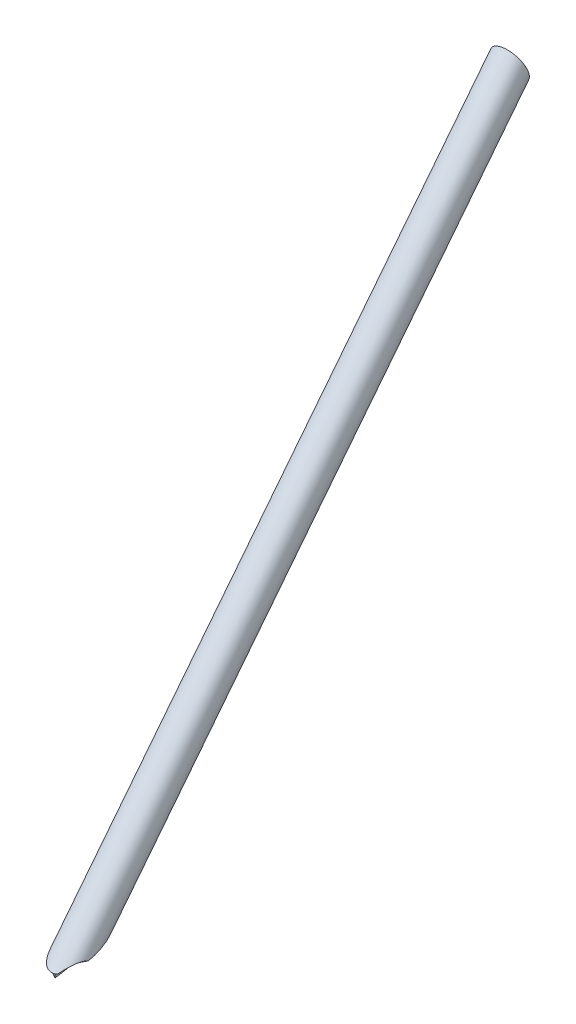
ISO-10303-21;
HEADER;
FILE_DESCRIPTION(('STEP AP214'),'2;1');
FILE_NAME('part.step','',(''),(''),'','','');
FILE_SCHEMA(('AUTOMOTIVE_DESIGN { 1 0 10303 214 1 1 1 1 }'));
ENDSEC;
DATA;
#1=APPLICATION_CONTEXT('core data for automotive mechanical design processes');
#2=APPLICATION_PROTOCOL_DEFINITION('international standard','automotive_design',2000,#1);
#3=PRODUCT_CONTEXT('',#1,'mechanical');
#4=PRODUCT('Part','Part','',(#3));
#5=PRODUCT_RELATED_PRODUCT_CATEGORY('part','',(#4));
#6=PRODUCT_DEFINITION_FORMATION('','',#4);
#7=PRODUCT_DEFINITION_CONTEXT('part definition',#1,'design');
#8=PRODUCT_DEFINITION('design','',#6,#7);
#9=PRODUCT_DEFINITION_SHAPE('','',#8);
#10=(LENGTH_UNIT() NAMED_UNIT(*) SI_UNIT(.MILLI.,.METRE.));
#11=(NAMED_UNIT(*) PLANE_ANGLE_UNIT() SI_UNIT($,.RADIAN.));
#12=(NAMED_UNIT(*) SI_UNIT($,.STERADIAN.) SOLID_ANGLE_UNIT());
#13=UNCERTAINTY_MEASURE_WITH_UNIT(LENGTH_MEASURE(1.E-05),#10,'distance_accuracy_value','');
#14=(GEOMETRIC_REPRESENTATION_CONTEXT(3) GLOBAL_UNCERTAINTY_ASSIGNED_CONTEXT((#13)) GLOBAL_UNIT_ASSIGNED_CONTEXT((#10,
#11,#12)) REPRESENTATION_CONTEXT('',''));
#15=CARTESIAN_POINT('',(0.,0.,0.));
#16=DIRECTION('',(0.,0.,1.));
#17=DIRECTION('',(1.,0.,0.));
#18=AXIS2_PLACEMENT_3D('',#15,#16,#17);
#19=CARTESIAN_POINT('',(80.,380.,-601.037933611912));
#20=DIRECTION('',(0.313257210262409,-0.388871019636094,0.866400167535647));
#21=DIRECTION('',(0.,-0.912318699307092,-0.409480879766828));
#22=AXIS2_PLACEMENT_3D('',#19,#20,#21);
#23=CYLINDRICAL_SURFACE('',#22,7.9);
#24=CARTESIAN_POINT('',(222.917953673779,195.377291508024,-208.993378649136));
#25=CARTESIAN_POINT('',(223.012888083571,195.433726930084,-209.119116882952));
#26=CARTESIAN_POINT('',(223.104138431984,195.494269848754,-209.245777184897));
#27=CARTESIAN_POINT('',(223.280105681698,195.622380933649,-209.500115327002));
#28=CARTESIAN_POINT('',(223.364820289401,195.689951546758,-209.627793507182));
#29=CARTESIAN_POINT('',(223.528634818153,195.831254385907,-209.883653952705));
#30=CARTESIAN_POINT('',(223.607725975371,195.904995855745,-210.011836689933));
#31=CARTESIAN_POINT('',(223.76092313275,196.05782740779,-210.26800651156));
#32=CARTESIAN_POINT('',(223.835028227753,196.136918455949,-210.395993556333));
#33=CARTESIAN_POINT('',(224.052309585371,196.382926969586,-210.781500524532));
#34=CARTESIAN_POINT('',(224.188892439851,196.557188455598,-211.038071091827));
#35=CARTESIAN_POINT('',(224.448919782311,196.921959419964,-211.545800007279));
#36=CARTESIAN_POINT('',(224.57237338362,197.112457460483,-211.796962011791));
#37=CARTESIAN_POINT('',(224.776942315472,197.454170356937,-212.224321036627));
#38=CARTESIAN_POINT('',(224.860398831385,197.601869886103,-212.402224269208));
#39=CARTESIAN_POINT('',(225.022962726354,197.904873781393,-212.753515374758));
#40=CARTESIAN_POINT('',(225.102069764739,198.06017874141,-212.926902893479));
#41=CARTESIAN_POINT('',(225.256678731087,198.37843097543,-213.268551379093));
#42=CARTESIAN_POINT('',(225.33217691551,198.541385851937,-213.436806959756));
#43=CARTESIAN_POINT('',(225.479981924259,198.874812249495,-213.767151978885));
#44=CARTESIAN_POINT('',(225.552288904873,199.04528340162,-213.929241719269));
#45=CARTESIAN_POINT('',(225.693490547132,199.392433386815,-214.24496796628));
#46=CARTESIAN_POINT('',(225.762408546937,199.56904896406,-214.398663460934));
#47=CARTESIAN_POINT('',(225.897711302474,199.93003633822,-214.697916975524));
#48=CARTESIAN_POINT('',(225.964095766927,200.114409021873,-214.84347406068));
#49=CARTESIAN_POINT('',(226.094345245231,200.490856212502,-215.124827940735));
#50=CARTESIAN_POINT('',(226.158213993559,200.682918378672,-215.260639469395));
#51=CARTESIAN_POINT('',(226.283530904535,201.075232073558,-215.521007538282));
#52=CARTESIAN_POINT('',(226.344979958603,201.27548052995,-215.645568245636));
#53=CARTESIAN_POINT('',(226.447392881952,201.623434466193,-215.846156403963));
#54=CARTESIAN_POINT('',(226.489000040282,201.768996786018,-215.925578307174));
#55=CARTESIAN_POINT('',(226.570879988235,202.064336964657,-216.076936352935));
#56=CARTESIAN_POINT('',(226.611152863824,202.21411455073,-216.148872978398));
#57=CARTESIAN_POINT('',(226.690286353838,202.518084660041,-216.284297909734));
#58=CARTESIAN_POINT('',(226.729144961922,202.672282939986,-216.347774529356));
#59=CARTESIAN_POINT('',(226.805203274731,202.984791359438,-216.464918322809));
#60=CARTESIAN_POINT('',(226.842402945545,203.143101582897,-216.518585296182));
#61=CARTESIAN_POINT('',(226.915318707242,203.465472644867,-216.615237316068));
#62=CARTESIAN_POINT('',(226.951011861693,203.629579509086,-216.658087577271));
#63=CARTESIAN_POINT('',(227.020095881777,203.961225532968,-216.730573180454));
#64=CARTESIAN_POINT('',(227.053486514953,204.128765036973,-216.7602071898));
#65=CARTESIAN_POINT('',(227.117453561461,204.465988042297,-216.804360539596));
#66=CARTESIAN_POINT('',(227.148036352898,204.635665636074,-216.818914949004));
#67=CARTESIAN_POINT('',(227.205953992873,204.97617559598,-216.831164635051));
#68=CARTESIAN_POINT('',(227.233290498168,205.147007325631,-216.828868549318));
#69=CARTESIAN_POINT('',(227.27660869455,205.437357188732,-216.809230315878));
#70=CARTESIAN_POINT('',(227.293552559481,205.557058073156,-216.796555616039));
#71=CARTESIAN_POINT('',(227.325367727987,205.79532950089,-216.761653431045));
#72=CARTESIAN_POINT('',(227.340239534495,205.913900311961,-216.73942826936));
#73=CARTESIAN_POINT('',(227.36772712879,206.1489753004,-216.685192411289));
#74=CARTESIAN_POINT('',(227.38034435484,206.265480752278,-216.653187988955));
#75=CARTESIAN_POINT('',(227.403191134437,206.495590795566,-216.579366525467));
#76=CARTESIAN_POINT('',(227.413420617519,206.609195301279,-216.5375491948));
#77=CARTESIAN_POINT('',(227.431404675484,206.83273599438,-216.44427565963));
#78=CARTESIAN_POINT('',(227.439156342965,206.942667737856,-216.392808243457));
#79=CARTESIAN_POINT('',(227.45212980558,207.157958152705,-216.280717691105));
#80=CARTESIAN_POINT('',(227.457350720433,207.263315221268,-216.22009137876));
#81=CARTESIAN_POINT('',(227.465277056629,207.4688063395,-216.090339044893));
#82=CARTESIAN_POINT('',(227.467981496067,207.568938336028,-216.021209717486));
#83=CARTESIAN_POINT('',(227.47094093104,207.763484956176,-215.875268256289));
#84=CARTESIAN_POINT('',(227.47119539067,207.857898324429,-215.798454445325));
#85=CARTESIAN_POINT('',(227.469129930289,208.063698052783,-215.617846764081));
#86=CARTESIAN_POINT('',(227.466147125814,208.17338879079,-215.512123181927));
#87=CARTESIAN_POINT('',(227.456780942833,208.383190077019,-215.291735007128));
#88=CARTESIAN_POINT('',(227.450396486557,208.483297577053,-215.177067590582));
#89=CARTESIAN_POINT('',(227.426556723743,208.769705265191,-214.82174132444));
#90=CARTESIAN_POINT('',(227.404417576352,208.941919936901,-214.569913228727));
#91=CARTESIAN_POINT('',(227.356234764604,209.216028962779,-214.107933438384));
#92=CARTESIAN_POINT('',(227.332272238128,209.324979180344,-213.901580818846));
#93=CARTESIAN_POINT('',(227.279095846365,209.524792600736,-213.480815802341));
#94=CARTESIAN_POINT('',(227.249879002338,209.615645482055,-213.266398888436));
#95=CARTESIAN_POINT('',(227.186772988359,209.781289980862,-212.831758977117));
#96=CARTESIAN_POINT('',(227.152875525742,209.85605247573,-212.611526248664));
#97=CARTESIAN_POINT('',(227.080876774896,209.991170373415,-212.167307852279));
#98=CARTESIAN_POINT('',(227.042773938359,210.051520443912,-211.943320828028));
#99=CARTESIAN_POINT('',(226.967170071168,210.153281906896,-211.51831938256));
#100=CARTESIAN_POINT('',(226.930083203064,210.196059843876,-211.317554095141));
#101=CARTESIAN_POINT('',(226.85293914097,210.272416541946,-210.914835503661));
#102=CARTESIAN_POINT('',(226.812881475298,210.305993838234,-210.712882015653));
#103=CARTESIAN_POINT('',(226.68827982986,210.394200770023,-210.105851263459));
#104=CARTESIAN_POINT('',(226.599343421633,210.436258600358,-209.699807799988));
#105=CARTESIAN_POINT('',(226.40913766025,210.492057891408,-208.888068066644));
#106=CARTESIAN_POINT('',(226.307846584326,210.505748692749,-208.482373709036));
#107=CARTESIAN_POINT('',(226.091354588214,210.508417497333,-207.674828554905));
#108=CARTESIAN_POINT('',(225.976160610319,210.497407786651,-207.272975947341));
#109=CARTESIAN_POINT('',(225.763795783198,210.459623860329,-206.58938036356));
#110=CARTESIAN_POINT('',(225.67083158185,210.438230593355,-206.306016005625));
#111=CARTESIAN_POINT('',(225.474155076724,210.384826129073,-205.743942110612));
#112=CARTESIAN_POINT('',(225.370440492558,210.352812675813,-205.465233575753));
#113=CARTESIAN_POINT('',(225.149939011165,210.278697870624,-204.915178227719));
#114=CARTESIAN_POINT('',(225.033185126912,210.236621700209,-204.643814891119));
#115=CARTESIAN_POINT('',(224.782856186307,210.142507957935,-204.110762193817));
#116=CARTESIAN_POINT('',(224.64929217133,210.090476913159,-203.849066627678));
#117=CARTESIAN_POINT('',(224.424528459865,210.001528868784,-203.452660568413));
#118=CARTESIAN_POINT('',(224.340714883951,209.968103612592,-203.312972759542));
#119=CARTESIAN_POINT('',(224.165502575251,209.898009301119,-203.039301887405));
#120=CARTESIAN_POINT('',(224.07410623106,209.861341267085,-202.905317047656));
#121=CARTESIAN_POINT('',(223.882978374415,209.784689112119,-202.644700624613));
#122=CARTESIAN_POINT('',(223.783259196538,209.744709899061,-202.518058615116));
#123=CARTESIAN_POINT('',(223.574674929642,209.661237798938,-202.273755976076));
#124=CARTESIAN_POINT('',(223.46581187372,209.617745693031,-202.156093361056));
#125=CARTESIAN_POINT('',(223.257198986513,209.534480814693,-201.950119399441));
#126=CARTESIAN_POINT('',(223.158864877578,209.495260820413,-201.860152986442));
#127=CARTESIAN_POINT('',(222.955755076029,209.41413902135,-201.689159176252));
#128=CARTESIAN_POINT('',(222.850980978708,209.372237880628,-201.60812957905));
#129=CARTESIAN_POINT('',(222.635580996831,209.28567993122,-201.456108997409));
#130=CARTESIAN_POINT('',(222.524959774306,209.241025313343,-201.385110176307));
#131=CARTESIAN_POINT('',(222.298673344678,209.148832520759,-201.253819301503));
#132=CARTESIAN_POINT('',(222.183008023939,209.10129428108,-201.193527489166));
#133=CARTESIAN_POINT('',(221.947946209618,209.003301821729,-201.08404474988));
#134=CARTESIAN_POINT('',(221.828554782513,208.952851488607,-201.034839438096));
#135=CARTESIAN_POINT('',(221.587170362089,208.848873809021,-200.947303863317));
#136=CARTESIAN_POINT('',(221.465177335506,208.7953464232,-200.908973739456));
#137=CARTESIAN_POINT('',(221.219635699899,208.6850060593,-200.84263902345));
#138=CARTESIAN_POINT('',(221.096084831561,208.628187738916,-200.814651797489));
#139=CARTESIAN_POINT('',(220.848740169297,208.511212165082,-200.768343470395));
#140=CARTESIAN_POINT('',(220.72494631865,208.451054011646,-200.750024988817));
#141=CARTESIAN_POINT('',(220.427388225815,208.301836143796,-200.716481000202));
#142=CARTESIAN_POINT('',(220.253987472562,208.211055871608,-200.705617554726));
#143=CARTESIAN_POINT('',(219.910873942064,208.022246686899,-200.698951509076));
#144=CARTESIAN_POINT('',(219.74116264417,207.924214933685,-200.703154842086));
#145=CARTESIAN_POINT('',(219.406967398977,207.720526131168,-200.724369254203));
#146=CARTESIAN_POINT('',(219.242489569331,207.614860598322,-200.741394787105));
#147=CARTESIAN_POINT('',(218.920338997022,207.395819981203,-200.786311135998));
#148=CARTESIAN_POINT('',(218.762665566206,207.282445679547,-200.814200850383));
#149=CARTESIAN_POINT('',(218.451143834345,207.044747848438,-200.8800687085));
#150=CARTESIAN_POINT('',(218.297509602692,206.920212984307,-200.918296003976));
#151=CARTESIAN_POINT('',(217.999697113041,206.662911240161,-201.002982012353));
#152=CARTESIAN_POINT('',(217.855518972799,206.530144257672,-201.049440827734));
#153=CARTESIAN_POINT('',(217.577684913564,206.256559124255,-201.149316624965));
#154=CARTESIAN_POINT('',(217.444025502087,206.115743672658,-201.20273128153));
#155=CARTESIAN_POINT('',(217.188143780322,205.82629222245,-201.315446203212));
#156=CARTESIAN_POINT('',(217.065921683216,205.67765607815,-201.374746577991));
#157=CARTESIAN_POINT('',(216.818449707006,205.352758974325,-201.506466109889));
#158=CARTESIAN_POINT('',(216.694943875566,205.175447006607,-201.579582460562));
#159=CARTESIAN_POINT('',(216.465036896667,204.812085638978,-201.730891239238));
#160=CARTESIAN_POINT('',(216.358637262913,204.626035467714,-201.809084115598));
#161=CARTESIAN_POINT('',(216.164085426222,204.246214889201,-201.969410091894));
#162=CARTESIAN_POINT('',(216.075934819798,204.052443808257,-202.051543535795));
#163=CARTESIAN_POINT('',(215.918889566562,203.65845011928,-202.218683884007));
#164=CARTESIAN_POINT('',(215.849993628238,203.458227944962,-202.303690595164));
#165=CARTESIAN_POINT('',(215.734867726172,203.061803652908,-202.471769907068));
#166=CARTESIAN_POINT('',(215.687764802661,202.865819763355,-202.554759983785));
#167=CARTESIAN_POINT('',(215.612343670876,202.470666681872,-202.72168872225));
#168=CARTESIAN_POINT('',(215.584025008878,202.271497566998,-202.805627361036));
#169=CARTESIAN_POINT('',(215.546447957857,201.871514583643,-202.973728691702));
#170=CARTESIAN_POINT('',(215.537185499508,201.670701075508,-203.057891331904));
#171=CARTESIAN_POINT('',(215.537750207621,201.268949260368,-203.225844852274));
#172=CARTESIAN_POINT('',(215.547577042793,201.06801095559,-203.309635738869));
#173=CARTESIAN_POINT('',(215.585424907072,200.674922537729,-203.473292469335));
#174=CARTESIAN_POINT('',(215.612767598652,200.482719716405,-203.553189812385));
#175=CARTESIAN_POINT('',(215.684636938621,200.101082578049,-203.711833940497));
#176=CARTESIAN_POINT('',(215.729163062789,199.911648176744,-203.790580760581));
#177=CARTESIAN_POINT('',(215.834869093322,199.536951800123,-203.946699267579));
#178=CARTESIAN_POINT('',(215.896046194203,199.351689127612,-204.02407118381));
#179=CARTESIAN_POINT('',(216.034397675555,198.986627479458,-204.17738254473));
#180=CARTESIAN_POINT('',(216.111572507493,198.806828658175,-204.253321948926));
#181=CARTESIAN_POINT('',(216.283407311308,198.449273056606,-204.405855833697));
#182=CARTESIAN_POINT('',(216.378478408997,198.271698357488,-204.482413848804));
#183=CARTESIAN_POINT('',(216.583734695358,197.924998694343,-204.634385497368));
#184=CARTESIAN_POINT('',(216.693920250783,197.75587393549,-204.709799103008));
#185=CARTESIAN_POINT('',(216.928573516772,197.42714427999,-204.860097143597));
#186=CARTESIAN_POINT('',(217.053063010664,197.267554481129,-204.934980582035));
#187=CARTESIAN_POINT('',(217.315093507492,196.959532309164,-205.084858885813));
#188=CARTESIAN_POINT('',(217.452634619372,196.811100029214,-205.159853752079));
#189=CARTESIAN_POINT('',(217.74781967697,196.518671882274,-205.315349883156));
#190=CARTESIAN_POINT('',(217.906164023397,196.375418041153,-205.395920366552));
#191=CARTESIAN_POINT('',(218.234594571858,196.104845444808,-205.560075865198));
#192=CARTESIAN_POINT('',(218.40468385696,195.97753089854,-205.643661669203));
#193=CARTESIAN_POINT('',(218.754235675553,195.741370653124,-205.815808955141));
#194=CARTESIAN_POINT('',(218.933675075028,195.632481961031,-205.904358194198));
#195=CARTESIAN_POINT('',(219.299747525741,195.435451907523,-206.089241304079));
#196=CARTESIAN_POINT('',(219.486375089876,195.347295071874,-206.185569296241));
#197=CARTESIAN_POINT('',(219.793251431257,195.222976637926,-206.351084656116));
#198=CARTESIAN_POINT('',(219.912373415154,195.179671075599,-206.417042118076));
#199=CARTESIAN_POINT('',(220.151005188231,195.103057228875,-206.553846790805));
#200=CARTESIAN_POINT('',(220.270514828831,195.06974548768,-206.624692300378));
#201=CARTESIAN_POINT('',(220.508468631539,195.013756730285,-206.771677314262));
#202=CARTESIAN_POINT('',(220.626914361182,194.991060062307,-206.847806733818));
#203=CARTESIAN_POINT('',(220.861596385622,194.956587119083,-207.005754442101));
#204=CARTESIAN_POINT('',(220.977832726072,194.944810617953,-207.087572613119));
#205=CARTESIAN_POINT('',(221.207162743245,194.932209315987,-207.257157945612));
#206=CARTESIAN_POINT('',(221.320243370483,194.931424729255,-207.344945771363));
#207=CARTESIAN_POINT('',(221.541642393554,194.940579543406,-207.525808650194));
#208=CARTESIAN_POINT('',(221.649960489993,194.950519617486,-207.618884034832));
#209=CARTESIAN_POINT('',(221.86109634729,194.98045261893,-207.809740108287));
#210=CARTESIAN_POINT('',(221.963908207163,195.000456101711,-207.90752563995));
#211=CARTESIAN_POINT('',(222.163459474489,195.049580788275,-208.106862234736));
#212=CARTESIAN_POINT('',(222.260199668272,195.078700808456,-208.208412807535));
#213=CARTESIAN_POINT('',(222.454861603191,195.147601918441,-208.422453077104));
#214=CARTESIAN_POINT('',(222.552289740284,195.188036169818,-208.535179176933));
#215=CARTESIAN_POINT('',(222.740160343575,195.276929151579,-208.762806038352));
#216=CARTESIAN_POINT('',(222.830616031523,195.325372117434,-208.877702142515));
#217=CARTESIAN_POINT('',(222.917953673779,195.377291508024,-208.993378649136));
#218=B_SPLINE_CURVE_WITH_KNOTS('',3,(#24,#25,#26,#27,#28,#29,#30,#31,#32,#33,#34,#35,#36,#37,
#38,#39,#40,#41,#42,#43,#44,#45,#46,#47,#48,#49,#50,#51,#52,#53,#54,#55,#56,#57,#58,#59,#60,#61,
#62,#63,#64,#65,#66,#67,#68,#69,#70,#71,#72,#73,#74,#75,#76,#77,#78,#79,#80,#81,#82,#83,#84,#85,
#86,#87,#88,#89,#90,#91,#92,#93,#94,#95,#96,#97,#98,#99,#100,#101,#102,#103,#104,#105,#106,#107,
#108,#109,#110,#111,#112,#113,#114,#115,#116,#117,#118,#119,#120,#121,#122,#123,#124,#125,#126,
#127,#128,#129,#130,#131,#132,#133,#134,#135,#136,#137,#138,#139,#140,#141,#142,#143,#144,#145,
#146,#147,#148,#149,#150,#151,#152,#153,#154,#155,#156,#157,#158,#159,#160,#161,#162,#163,#164,
#165,#166,#167,#168,#169,#170,#171,#172,#173,#174,#175,#176,#177,#178,#179,#180,#181,#182,#183,
#184,#185,#186,#187,#188,#189,#190,#191,#192,#193,#194,#195,#196,#197,#198,#199,#200,#201,#202,
#203,#204,#205,#206,#207,#208,#209,#210,#211,#212,#213,#214,#215,#216,#217),.UNSPECIFIED.,.T.,
.F.,(4,2,2,2,2,2,2,2,2,2,2,2,2,2,2,2,2,2,2,2,2,2,2,2,2,2,2,2,2,2,2,2,2,2,2,2,2,2,2,2,2,2,2,2,2,
2,2,2,2,2,2,2,2,2,2,2,2,2,2,2,2,2,2,2,2,2,2,2,2,2,2,2,2,2,2,2,2,2,2,2,2,2,2,2,2,2,2,2,2,2,2,2,2,
2,2,2,4),(0.,0.501979882139959,1.00413513115702,1.50705654486524,2.01006901276527,
3.02582965679059,4.04088057087987,4.77816509051023,5.51550727539363,6.25359842143106,
6.99165337942038,7.72358343543751,8.45559738902988,9.18648025840631,9.91709130059194,
10.4297824288632,10.9424404602356,11.4557994712605,11.9691689714871,12.4886505993399,
13.0081845962283,13.5265076397798,14.0445650075223,14.4088782944886,14.7731030001686,
15.1370945201267,15.5010967803833,15.8655245963429,16.2300790817395,16.5947757529522,
16.9595521953224,17.4159798550026,17.8725522138062,18.7863795763021,19.489253331177,
20.1925268175672,20.8970626764465,21.6018587975711,22.2273983694161,22.8530374734779,
24.1049509723517,25.3590982857574,26.6126219226086,27.5092439394124,28.4060565397738,
29.3006479655709,30.1946548349904,30.6933035171722,31.1917957155066,31.6895618299293,
32.1872175599734,32.6035896846045,33.0198590793758,33.4358014387766,33.8517531734629,
34.2671620585494,34.6825762580347,35.0986848209849,35.5149060625066,36.1021133349873,
36.689551870661,37.2776535880257,37.865695688492,38.4694161526876,39.0731441335758,
39.6766708083439,40.2802087301075,40.9637044712596,41.6472606608144,42.3308766258931,
43.0144467262124,43.66756673397,44.3206709652979,44.9736357159824,45.6265891346724,
46.2556697851232,46.8847312455688,47.5136867824818,48.1426600714146,48.7883935293106,
49.4341426587155,50.0808885633705,50.7276398670165,51.411464287665,52.0954689009139,
52.7778548394478,53.4597298177942,53.8880091039281,54.3161400797527,54.7434752845412,
55.170801649754,55.599690989175,56.0286072519842,56.457974342071,56.8872857104392,
57.3499967453641,57.8118075836265),.UNSPECIFIED.);
#219=CARTESIAN_POINT('',(227.073447228601,210.,-212.126605746777));
#220=VERTEX_POINT('',#219);
#221=CARTESIAN_POINT('',(224.420881433489,210.,-203.449159749218));
#222=VERTEX_POINT('',#221);
#223=EDGE_CURVE('E107',#220,#222,#218,.T.);
#224=ORIENTED_EDGE('',*,*,#223,.T.);
#225=CARTESIAN_POINT('',(216.944444444445,210.,-222.279885200662));
#226=DIRECTION('',(0.,-1.,0.));
#227=DIRECTION('',(0.340019385805579,0.,0.940418426699731));
#228=AXIS2_PLACEMENT_3D('',#225,#226,#227);
#229=ELLIPSE('',#228,20.3152191885958,7.9);
#230=CARTESIAN_POINT('',(214.223926995827,210.,-210.));
#231=VERTEX_POINT('',#230);
#232=EDGE_CURVE('E96',#222,#231,#229,.T.);
#233=ORIENTED_EDGE('',*,*,#232,.T.);
#234=CARTESIAN_POINT('',(221.38438192881,204.488353467685,-210.));
#235=DIRECTION('',(0.,0.,1.));
#236=DIRECTION('',(0.627329537872645,-0.778753909083283,0.));
#237=AXIS2_PLACEMENT_3D('',#234,#235,#236);
#238=ELLIPSE('',#237,9.11818844919022,7.9);
#239=CARTESIAN_POINT('',(215.,199.831593159286,-210.));
#240=VERTEX_POINT('',#239);
#241=EDGE_CURVE('E106',#231,#240,#238,.T.);
#242=ORIENTED_EDGE('',*,*,#241,.T.);
#243=CARTESIAN_POINT('',(215.,212.413793103448,-227.657788524959));
#244=DIRECTION('',(1.,0.,0.));
#245=DIRECTION('',(0.,-0.409480879766828,0.912318699307092));
#246=AXIS2_PLACEMENT_3D('',#243,#244,#245);
#247=ELLIPSE('',#246,25.2188927858431,7.9);
#248=CARTESIAN_POINT('',(215.,210.,-239.923532285982));
#249=VERTEX_POINT('',#248);
#250=EDGE_CURVE('E87',#240,#249,#247,.T.);
#251=ORIENTED_EDGE('',*,*,#250,.T.);
#252=EDGE_CURVE('E58',#249,#220,#229,.T.);
#253=ORIENTED_EDGE('',*,*,#252,.T.);
#254=EDGE_LOOP('',(#224,#233,#242,#251,#253));
#255=FACE_BOUND('',#254,.T.);
#256=CARTESIAN_POINT('',(80.0000000000001,380.,-601.037933611912));
#257=DIRECTION('',(-0.0877040448988902,0.311824264686694,-0.946083309471728));
#258=DIRECTION('',(0.915766996856784,-0.348518707826595,-0.199763654759287));
#259=AXIS2_PLACEMENT_3D('',#256,#257,#258);
#260=ELLIPSE('',#259,8.15761687173193,7.9);
#261=CARTESIAN_POINT('',(87.4704763041343,377.15691790892,-602.667528972335));
#262=VERTEX_POINT('',#261);
#263=EDGE_CURVE('E45',#262,#262,#260,.T.);
#264=ORIENTED_EDGE('',*,*,#263,.T.);
#265=EDGE_LOOP('',(#264));
#266=FACE_BOUND('',#265,.T.);
#267=ADVANCED_FACE('F41',(#255,#266),#23,.F.);
#268=CARTESIAN_POINT('',(80.,380.,-601.037933611912));
#269=DIRECTION('',(0.313257210262409,-0.388871019636094,0.866400167535647));
#270=DIRECTION('',(0.,-0.912318699307092,-0.409480879766828));
#271=AXIS2_PLACEMENT_3D('',#268,#269,#270);
#272=CYLINDRICAL_SURFACE('',#271,9.5);
#273=CARTESIAN_POINT('',(216.944444444445,210.,-222.279885200662));
#274=DIRECTION('',(0.,-1.,0.));
#275=DIRECTION('',(0.340019385805579,0.,0.940418426699731));
#276=AXIS2_PLACEMENT_3D('',#273,#274,#275);
#277=ELLIPSE('',#276,24.4296939609696,9.5);
#278=CARTESIAN_POINT('',(226.408415127519,210.,-199.974629586691));
#279=VERTEX_POINT('',#278);
#280=CARTESIAN_POINT('',(212.152625115666,210.,-210.));
#281=VERTEX_POINT('',#280);
#282=EDGE_CURVE('E152',#279,#281,#277,.T.);
#283=ORIENTED_EDGE('',*,*,#282,.F.);
#284=CARTESIAN_POINT('',(225.,200.,-200.));
#285=DIRECTION('',(0.979997411230481,-0.1383871597552,0.143017719169493));
#286=DIRECTION('',(-0.18494238420669,-0.367901037751926,0.911287627999525));
#287=AXIS2_PLACEMENT_3D('',#284,#285,#286);
#288=ELLIPSE('',#287,19.5990817258114,9.5);
#289=CARTESIAN_POINT('',(228.616604705313,210.,-215.105762164606));
#290=VERTEX_POINT('',#289);
#291=EDGE_CURVE('E114',#290,#279,#288,.T.);
#292=ORIENTED_EDGE('',*,*,#291,.F.);
#293=CARTESIAN_POINT('',(215.,210.,-243.177807236862));
#294=VERTEX_POINT('',#293);
#295=EDGE_CURVE('E50',#294,#290,#277,.T.);
#296=ORIENTED_EDGE('',*,*,#295,.F.);
#297=CARTESIAN_POINT('',(215.,212.413793103448,-227.657788524959));
#298=DIRECTION('',(1.,0.,0.));
#299=DIRECTION('',(0.,-0.409480879766828,0.912318699307092));
#300=AXIS2_PLACEMENT_3D('',#297,#298,#299);
#301=ELLIPSE('',#300,30.3265166412037,9.5);
#302=CARTESIAN_POINT('',(215.,197.413463504428,-210.));
#303=VERTEX_POINT('',#302);
#304=EDGE_CURVE('E83',#303,#294,#301,.T.);
#305=ORIENTED_EDGE('',*,*,#304,.F.);
#306=CARTESIAN_POINT('',(221.38438192881,204.488353467685,-210.));
#307=DIRECTION('',(0.,0.,1.));
#308=DIRECTION('',(0.627329537872645,-0.778753909083283,0.));
#309=AXIS2_PLACEMENT_3D('',#306,#307,#308);
#310=ELLIPSE('',#309,10.9649101604186,9.5);
#311=EDGE_CURVE('E167',#281,#303,#310,.T.);
#312=ORIENTED_EDGE('',*,*,#311,.F.);
#313=EDGE_LOOP('',(#283,#292,#296,#305,#312));
#314=FACE_BOUND('',#313,.T.);
#315=CARTESIAN_POINT('',(80.0000000000001,380.,-601.037933611912));
#316=DIRECTION('',(-0.0877040448988902,0.311824264686694,-0.946083309471728));
#317=DIRECTION('',(0.915766996856784,-0.348518707826595,-0.199763654759287));
#318=AXIS2_PLACEMENT_3D('',#315,#316,#317);
#319=ELLIPSE('',#318,9.80979244069028,9.5);
#320=CARTESIAN_POINT('',(88.9834841631994,376.581103814524,-602.997573602294));
#321=VERTEX_POINT('',#320);
#322=EDGE_CURVE('E11',#321,#321,#319,.T.);
#323=ORIENTED_EDGE('',*,*,#322,.F.);
#324=EDGE_LOOP('',(#323));
#325=FACE_BOUND('',#324,.T.);
#326=ADVANCED_FACE('F132',(#314,#325),#272,.T.);
#327=CARTESIAN_POINT('',(50.0000000000001,130.,1.11022302462516E-13));
#328=DIRECTION('',(0.636784790371593,0.254713916148637,-0.727754046138963));
#329=DIRECTION('',(-0.752576694706878,0.,-0.658504607868518));
#330=AXIS2_PLACEMENT_3D('',#327,#328,#329);
#331=CYLINDRICAL_SURFACE('',#330,9.5);
#332=ORIENTED_EDGE('',*,*,#291,.T.);
#333=CARTESIAN_POINT('',(250.,210.,-228.571428571428));
#334=DIRECTION('',(0.,-1.,0.));
#335=DIRECTION('',(0.658504607868518,0.,-0.752576694706878));
#336=AXIS2_PLACEMENT_3D('',#333,#334,#335);
#337=ELLIPSE('',#336,37.2967450842235,9.5);
#338=EDGE_CURVE('E99',#279,#222,#337,.T.);
#339=ORIENTED_EDGE('',*,*,#338,.T.);
#340=ORIENTED_EDGE('',*,*,#223,.F.);
#341=EDGE_CURVE('E64',#220,#290,#337,.T.);
#342=ORIENTED_EDGE('',*,*,#341,.T.);
#343=EDGE_LOOP('',(#332,#339,#340,#342));
#344=FACE_BOUND('',#343,.T.);
#345=ADVANCED_FACE('F112',(#344),#331,.F.);
#346=CARTESIAN_POINT('',(-225.,190.,-210.));
#347=DIRECTION('',(0.,0.,1.));
#348=DIRECTION('',(1.,0.,0.));
#349=AXIS2_PLACEMENT_3D('',#346,#347,#348);
#350=PLANE('',#349);
#351=DIRECTION('',(1.,0.,0.));
#352=VECTOR('',#351,1.);
#353=CARTESIAN_POINT('',(-225.,210.,-210.));
#354=LINE('',#353,#352);
#355=EDGE_CURVE('E102',#281,#231,#354,.T.);
#356=ORIENTED_EDGE('',*,*,#355,.F.);
#357=ORIENTED_EDGE('',*,*,#311,.T.);
#358=DIRECTION('',(0.,1.,0.));
#359=VECTOR('',#358,1.);
#360=CARTESIAN_POINT('',(215.,190.,-210.));
#361=LINE('',#360,#359);
#362=EDGE_CURVE('E166',#303,#240,#361,.T.);
#363=ORIENTED_EDGE('',*,*,#362,.T.);
#364=ORIENTED_EDGE('',*,*,#241,.F.);
#365=EDGE_LOOP('',(#356,#357,#363,#364));
#366=FACE_BOUND('',#365,.T.);
#367=ADVANCED_FACE('F131',(#366),#350,.T.);
#368=CARTESIAN_POINT('',(215.,190.,-200.));
#369=DIRECTION('',(1.,0.,0.));
#370=DIRECTION('',(0.,0.,-1.));
#371=AXIS2_PLACEMENT_3D('',#368,#369,#370);
#372=PLANE('',#371);
#373=ORIENTED_EDGE('',*,*,#362,.F.);
#374=ORIENTED_EDGE('',*,*,#304,.T.);
#375=DIRECTION('',(0.,0.,-1.));
#376=VECTOR('',#375,1.);
#377=CARTESIAN_POINT('',(215.,210.,-200.));
#378=LINE('',#377,#376);
#379=EDGE_CURVE('E164',#249,#294,#378,.T.);
#380=ORIENTED_EDGE('',*,*,#379,.F.);
#381=ORIENTED_EDGE('',*,*,#250,.F.);
#382=EDGE_LOOP('',(#373,#374,#380,#381));
#383=FACE_BOUND('',#382,.T.);
#384=ADVANCED_FACE('F135',(#383),#372,.T.);
#385=CARTESIAN_POINT('',(-225.,210.,-190.));
#386=DIRECTION('',(0.,-1.,0.));
#387=DIRECTION('',(0.,0.,-1.));
#388=AXIS2_PLACEMENT_3D('',#385,#386,#387);
#389=PLANE('',#388);
#390=ORIENTED_EDGE('',*,*,#338,.F.);
#391=ORIENTED_EDGE('',*,*,#282,.T.);
#392=ORIENTED_EDGE('',*,*,#355,.T.);
#393=ORIENTED_EDGE('',*,*,#232,.F.);
#394=EDGE_LOOP('',(#390,#391,#392,#393));
#395=FACE_BOUND('',#394,.T.);
#396=ADVANCED_FACE('F98',(#395),#389,.T.);
#397=ORIENTED_EDGE('',*,*,#379,.T.);
#398=ORIENTED_EDGE('',*,*,#295,.T.);
#399=ORIENTED_EDGE('',*,*,#341,.F.);
#400=ORIENTED_EDGE('',*,*,#252,.F.);
#401=EDGE_LOOP('',(#397,#398,#399,#400));
#402=FACE_BOUND('',#401,.T.);
#403=ADVANCED_FACE('F137',(#402),#389,.T.);
#404=CARTESIAN_POINT('',(80.,380.,-601.037933611912));
#405=DIRECTION('',(-0.0877040448988902,0.311824264686694,-0.946083309471728));
#406=DIRECTION('',(0.,0.949743072396233,0.313030504001389));
#407=AXIS2_PLACEMENT_3D('',#404,#405,#406);
#408=PLANE('',#407);
#409=ORIENTED_EDGE('',*,*,#263,.F.);
#410=EDGE_LOOP('',(#409));
#411=FACE_BOUND('',#410,.T.);
#412=ORIENTED_EDGE('',*,*,#322,.T.);
#413=EDGE_LOOP('',(#412));
#414=FACE_BOUND('',#413,.T.);
#415=ADVANCED_FACE('F43',(#411,#414),#408,.T.);
#416=CLOSED_SHELL('',(#267,#326,#345,#367,#384,#396,#403,#415));
#417=MANIFOLD_SOLID_BREP('B2',#416);
#418=ADVANCED_BREP_SHAPE_REPRESENTATION('',(#18,#417),#14);
#419=SHAPE_DEFINITION_REPRESENTATION(#9,#418);
ENDSEC;
END-ISO-10303-21;
